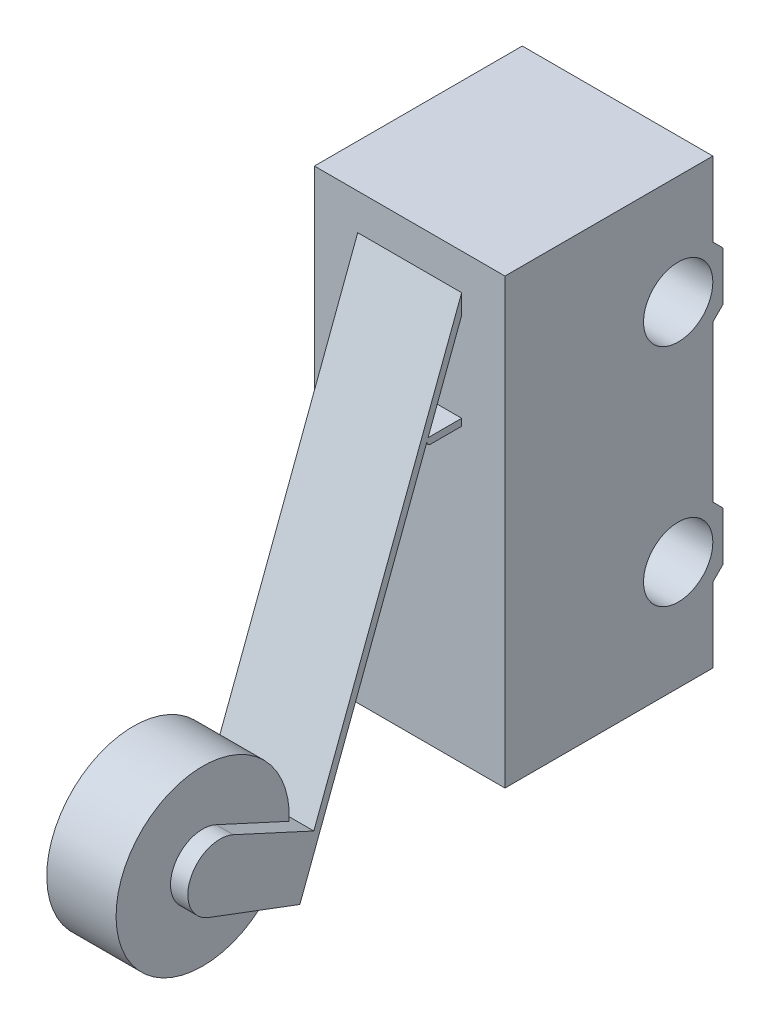
ISO-10303-21;
HEADER;
FILE_DESCRIPTION(('STEP AP214'),'2;1');
FILE_NAME('part.step','',(''),(''),'','','');
FILE_SCHEMA(('AUTOMOTIVE_DESIGN { 1 0 10303 214 1 1 1 1 }'));
ENDSEC;
DATA;
#1=APPLICATION_CONTEXT('core data for automotive mechanical design processes');
#2=APPLICATION_PROTOCOL_DEFINITION('international standard','automotive_design',2000,#1);
#3=PRODUCT_CONTEXT('',#1,'mechanical');
#4=PRODUCT('Part','Part','',(#3));
#5=PRODUCT_RELATED_PRODUCT_CATEGORY('part','',(#4));
#6=PRODUCT_DEFINITION_FORMATION('','',#4);
#7=PRODUCT_DEFINITION_CONTEXT('part definition',#1,'design');
#8=PRODUCT_DEFINITION('design','',#6,#7);
#9=PRODUCT_DEFINITION_SHAPE('','',#8);
#10=(LENGTH_UNIT() NAMED_UNIT(*) SI_UNIT(.MILLI.,.METRE.));
#11=(NAMED_UNIT(*) PLANE_ANGLE_UNIT() SI_UNIT($,.RADIAN.));
#12=(NAMED_UNIT(*) SI_UNIT($,.STERADIAN.) SOLID_ANGLE_UNIT());
#13=UNCERTAINTY_MEASURE_WITH_UNIT(LENGTH_MEASURE(1.E-05),#10,'distance_accuracy_value','');
#14=(GEOMETRIC_REPRESENTATION_CONTEXT(3) GLOBAL_UNCERTAINTY_ASSIGNED_CONTEXT((#13)) GLOBAL_UNIT_ASSIGNED_CONTEXT((#10,
#11,#12)) REPRESENTATION_CONTEXT('',''));
#15=CARTESIAN_POINT('',(0.,0.,0.));
#16=DIRECTION('',(0.,0.,1.));
#17=DIRECTION('',(1.,0.,0.));
#18=AXIS2_PLACEMENT_3D('',#15,#16,#17);
#19=CARTESIAN_POINT('',(-1.5,-12.1396148632047,6.97512508538025));
#20=DIRECTION('',(1.,0.,0.));
#21=DIRECTION('',(0.,0.,-1.));
#22=AXIS2_PLACEMENT_3D('',#19,#20,#21);
#23=CYLINDRICAL_SURFACE('',#22,0.927948868354279);
#24=DIRECTION('',(1.,0.,0.));
#25=VECTOR('',#24,1.);
#26=CARTESIAN_POINT('',(-1.5,-13.0079476813417,7.30236692137663));
#27=LINE('',#26,#25);
#28=CARTESIAN_POINT('',(-1.5,-13.0079476813417,7.30236692137663));
#29=VERTEX_POINT('',#28);
#30=CARTESIAN_POINT('',(-1.,-13.0079476813417,7.30236692137663));
#31=VERTEX_POINT('',#30);
#32=EDGE_CURVE('E332',#29,#31,#27,.T.);
#33=ORIENTED_EDGE('',*,*,#32,.T.);
#34=CARTESIAN_POINT('',(-1.,-12.1396148632047,6.97512508538025));
#35=DIRECTION('',(1.,0.,0.));
#36=DIRECTION('',(0.,0.,-1.));
#37=AXIS2_PLACEMENT_3D('',#34,#35,#36);
#38=CIRCLE('',#37,0.927948868354279);
#39=CARTESIAN_POINT('',(-1.,-11.2964810406253,6.58754998362256));
#40=VERTEX_POINT('',#39);
#41=EDGE_CURVE('E219',#31,#40,#38,.F.);
#42=ORIENTED_EDGE('',*,*,#41,.T.);
#43=DIRECTION('',(1.,0.,0.));
#44=VECTOR('',#43,1.);
#45=CARTESIAN_POINT('',(-1.5,-11.2964810406253,6.58754998362256));
#46=LINE('',#45,#44);
#47=CARTESIAN_POINT('',(-1.5,-11.2964810406253,6.58754998362256));
#48=VERTEX_POINT('',#47);
#49=EDGE_CURVE('E336',#48,#40,#46,.T.);
#50=ORIENTED_EDGE('',*,*,#49,.F.);
#51=CARTESIAN_POINT('',(-1.5,-12.1396148632047,6.97512508538025));
#52=DIRECTION('',(1.,0.,0.));
#53=DIRECTION('',(0.,0.,-1.));
#54=AXIS2_PLACEMENT_3D('',#51,#52,#53);
#55=CIRCLE('',#54,0.927948868354279);
#56=EDGE_CURVE('E308',#48,#29,#55,.T.);
#57=ORIENTED_EDGE('',*,*,#56,.T.);
#58=EDGE_LOOP('',(#33,#42,#50,#57));
#59=FACE_BOUND('',#58,.T.);
#60=ADVANCED_FACE('F39',(#59),#23,.T.);
#61=CARTESIAN_POINT('',(-2.75,0.,0.));
#62=DIRECTION('',(0.,0.,1.));
#63=DIRECTION('',(0.,-1.,0.));
#64=AXIS2_PLACEMENT_3D('',#61,#62,#63);
#65=PLANE('',#64);
#66=DIRECTION('',(1.,0.,0.));
#67=VECTOR('',#66,1.);
#68=CARTESIAN_POINT('',(-2.75,-12.8,0.));
#69=LINE('',#68,#67);
#70=CARTESIAN_POINT('',(-2.75,-12.8,0.));
#71=VERTEX_POINT('',#70);
#72=CARTESIAN_POINT('',(2.75,-12.8,0.));
#73=VERTEX_POINT('',#72);
#74=EDGE_CURVE('E466',#71,#73,#69,.T.);
#75=ORIENTED_EDGE('',*,*,#74,.T.);
#76=DIRECTION('',(0.,-1.,0.));
#77=VECTOR('',#76,1.);
#78=CARTESIAN_POINT('',(2.75,0.,0.));
#79=LINE('',#78,#77);
#80=CARTESIAN_POINT('',(2.75,0.,0.));
#81=VERTEX_POINT('',#80);
#82=EDGE_CURVE('E362',#81,#73,#79,.T.);
#83=ORIENTED_EDGE('',*,*,#82,.F.);
#84=DIRECTION('',(1.,0.,0.));
#85=VECTOR('',#84,1.);
#86=CARTESIAN_POINT('',(-2.75,0.,0.));
#87=LINE('',#86,#85);
#88=CARTESIAN_POINT('',(-2.75,0.,0.));
#89=VERTEX_POINT('',#88);
#90=EDGE_CURVE('E467',#89,#81,#87,.T.);
#91=ORIENTED_EDGE('',*,*,#90,.F.);
#92=DIRECTION('',(0.,-1.,0.));
#93=VECTOR('',#92,1.);
#94=CARTESIAN_POINT('',(-2.75,0.,0.));
#95=LINE('',#94,#93);
#96=EDGE_CURVE('E418',#89,#71,#95,.T.);
#97=ORIENTED_EDGE('',*,*,#96,.T.);
#98=EDGE_LOOP('',(#75,#83,#91,#97));
#99=FACE_BOUND('',#98,.T.);
#100=DIRECTION('',(1.,0.,0.));
#101=VECTOR('',#100,1.);
#102=CARTESIAN_POINT('',(-2.75,-1.60829263563845,0.));
#103=LINE('',#102,#101);
#104=CARTESIAN_POINT('',(-1.5,-1.60829263563845,0.));
#105=VERTEX_POINT('',#104);
#106=CARTESIAN_POINT('',(1.5,-1.60829263563845,0.));
#107=VERTEX_POINT('',#106);
#108=EDGE_CURVE('E506',#105,#107,#103,.T.);
#109=ORIENTED_EDGE('',*,*,#108,.F.);
#110=DIRECTION('',(0.,1.,0.));
#111=VECTOR('',#110,1.);
#112=CARTESIAN_POINT('',(-1.5,0.,0.));
#113=LINE('',#112,#111);
#114=CARTESIAN_POINT('',(-1.5,-1.04115923991667,0.));
#115=VERTEX_POINT('',#114);
#116=EDGE_CURVE('E510',#105,#115,#113,.T.);
#117=ORIENTED_EDGE('',*,*,#116,.T.);
#118=DIRECTION('',(1.,0.,0.));
#119=VECTOR('',#118,1.);
#120=CARTESIAN_POINT('',(-1.5,-1.04115923991667,0.));
#121=LINE('',#120,#119);
#122=CARTESIAN_POINT('',(1.5,-1.04115923991667,0.));
#123=VERTEX_POINT('',#122);
#124=EDGE_CURVE('E344',#115,#123,#121,.T.);
#125=ORIENTED_EDGE('',*,*,#124,.T.);
#126=DIRECTION('',(0.,1.,0.));
#127=VECTOR('',#126,1.);
#128=CARTESIAN_POINT('',(1.5,0.,0.));
#129=LINE('',#128,#127);
#130=EDGE_CURVE('E470',#107,#123,#129,.T.);
#131=ORIENTED_EDGE('',*,*,#130,.F.);
#132=EDGE_LOOP('',(#109,#117,#125,#131));
#133=FACE_BOUND('',#132,.T.);
#134=DIRECTION('',(1.,0.,0.));
#135=VECTOR('',#134,1.);
#136=CARTESIAN_POINT('',(-1.5,-4.38,0.));
#137=LINE('',#136,#135);
#138=CARTESIAN_POINT('',(-1.5,-4.38,0.));
#139=VERTEX_POINT('',#138);
#140=CARTESIAN_POINT('',(1.5,-4.38,0.));
#141=VERTEX_POINT('',#140);
#142=EDGE_CURVE('E63',#139,#141,#137,.T.);
#143=ORIENTED_EDGE('',*,*,#142,.F.);
#144=DIRECTION('',(0.,1.,0.));
#145=VECTOR('',#144,1.);
#146=CARTESIAN_POINT('',(-1.5,-4.38,0.));
#147=LINE('',#146,#145);
#148=CARTESIAN_POINT('',(-1.5,-4.18,0.));
#149=VERTEX_POINT('',#148);
#150=EDGE_CURVE('E290',#139,#149,#147,.T.);
#151=ORIENTED_EDGE('',*,*,#150,.T.);
#152=DIRECTION('',(1.,0.,0.));
#153=VECTOR('',#152,1.);
#154=CARTESIAN_POINT('',(-1.5,-4.18,0.));
#155=LINE('',#154,#153);
#156=CARTESIAN_POINT('',(1.5,-4.18,0.));
#157=VERTEX_POINT('',#156);
#158=EDGE_CURVE('E350',#149,#157,#155,.T.);
#159=ORIENTED_EDGE('',*,*,#158,.T.);
#160=DIRECTION('',(0.,1.,0.));
#161=VECTOR('',#160,1.);
#162=CARTESIAN_POINT('',(1.5,-4.38,0.));
#163=LINE('',#162,#161);
#164=EDGE_CURVE('E246',#141,#157,#163,.T.);
#165=ORIENTED_EDGE('',*,*,#164,.F.);
#166=EDGE_LOOP('',(#143,#151,#159,#165));
#167=FACE_BOUND('',#166,.T.);
#168=ADVANCED_FACE('F41',(#99,#133,#167),#65,.T.);
#169=CARTESIAN_POINT('',(-2.75,0.,0.));
#170=DIRECTION('',(0.,1.,0.));
#171=DIRECTION('',(0.,0.,1.));
#172=AXIS2_PLACEMENT_3D('',#169,#170,#171);
#173=PLANE('',#172);
#174=ORIENTED_EDGE('',*,*,#90,.T.);
#175=DIRECTION('',(0.,0.,1.));
#176=VECTOR('',#175,1.);
#177=CARTESIAN_POINT('',(2.75,0.,0.));
#178=LINE('',#177,#176);
#179=CARTESIAN_POINT('',(2.75,0.,-6.));
#180=VERTEX_POINT('',#179);
#181=EDGE_CURVE('E406',#180,#81,#178,.T.);
#182=ORIENTED_EDGE('',*,*,#181,.F.);
#183=DIRECTION('',(1.,0.,0.));
#184=VECTOR('',#183,1.);
#185=CARTESIAN_POINT('',(-2.75,0.,-6.));
#186=LINE('',#185,#184);
#187=CARTESIAN_POINT('',(-2.75,0.,-6.));
#188=VERTEX_POINT('',#187);
#189=EDGE_CURVE('E471',#188,#180,#186,.T.);
#190=ORIENTED_EDGE('',*,*,#189,.F.);
#191=DIRECTION('',(0.,0.,1.));
#192=VECTOR('',#191,1.);
#193=CARTESIAN_POINT('',(-2.75,0.,0.));
#194=LINE('',#193,#192);
#195=EDGE_CURVE('E462',#188,#89,#194,.T.);
#196=ORIENTED_EDGE('',*,*,#195,.T.);
#197=EDGE_LOOP('',(#174,#182,#190,#196));
#198=FACE_BOUND('',#197,.T.);
#199=ADVANCED_FACE('F575',(#198),#173,.T.);
#200=CARTESIAN_POINT('',(-2.75,0.,-6.));
#201=DIRECTION('',(0.,0.,-1.));
#202=DIRECTION('',(-1.,0.,0.));
#203=AXIS2_PLACEMENT_3D('',#200,#201,#202);
#204=PLANE('',#203);
#205=ORIENTED_EDGE('',*,*,#189,.T.);
#206=DIRECTION('',(0.,1.,0.));
#207=VECTOR('',#206,1.);
#208=CARTESIAN_POINT('',(2.75,0.,-6.));
#209=LINE('',#208,#207);
#210=CARTESIAN_POINT('',(2.75,-2.15,-6.));
#211=VERTEX_POINT('',#210);
#212=EDGE_CURVE('E402',#211,#180,#209,.T.);
#213=ORIENTED_EDGE('',*,*,#212,.F.);
#214=DIRECTION('',(1.,0.,0.));
#215=VECTOR('',#214,1.);
#216=CARTESIAN_POINT('',(-2.75,-2.15,-6.));
#217=LINE('',#216,#215);
#218=CARTESIAN_POINT('',(-2.75,-2.15,-6.));
#219=VERTEX_POINT('',#218);
#220=EDGE_CURVE('E474',#219,#211,#217,.T.);
#221=ORIENTED_EDGE('',*,*,#220,.F.);
#222=DIRECTION('',(0.,1.,0.));
#223=VECTOR('',#222,1.);
#224=CARTESIAN_POINT('',(-2.75,0.,-6.));
#225=LINE('',#224,#223);
#226=EDGE_CURVE('E458',#219,#188,#225,.T.);
#227=ORIENTED_EDGE('',*,*,#226,.T.);
#228=EDGE_LOOP('',(#205,#213,#221,#227));
#229=FACE_BOUND('',#228,.T.);
#230=ADVANCED_FACE('F581',(#229),#204,.T.);
#231=CARTESIAN_POINT('',(-2.75,-2.15,-6.));
#232=DIRECTION('',(0.,0.707106781186546,-0.707106781186549));
#233=DIRECTION('',(0.,0.707106781186549,0.707106781186546));
#234=AXIS2_PLACEMENT_3D('',#231,#232,#233);
#235=PLANE('',#234);
#236=ORIENTED_EDGE('',*,*,#220,.T.);
#237=DIRECTION('',(0.,0.707106781186549,0.707106781186547));
#238=VECTOR('',#237,1.);
#239=CARTESIAN_POINT('',(2.75,-2.15,-6.));
#240=LINE('',#239,#238);
#241=CARTESIAN_POINT('',(2.75,-2.45,-6.3));
#242=VERTEX_POINT('',#241);
#243=EDGE_CURVE('E398',#242,#211,#240,.T.);
#244=ORIENTED_EDGE('',*,*,#243,.F.);
#245=DIRECTION('',(1.,0.,0.));
#246=VECTOR('',#245,1.);
#247=CARTESIAN_POINT('',(-2.75,-2.45,-6.3));
#248=LINE('',#247,#246);
#249=CARTESIAN_POINT('',(-2.75,-2.45,-6.3));
#250=VERTEX_POINT('',#249);
#251=EDGE_CURVE('E477',#250,#242,#248,.T.);
#252=ORIENTED_EDGE('',*,*,#251,.F.);
#253=DIRECTION('',(0.,0.707106781186549,0.707106781186547));
#254=VECTOR('',#253,1.);
#255=CARTESIAN_POINT('',(-2.75,-2.15,-6.));
#256=LINE('',#255,#254);
#257=EDGE_CURVE('E454',#250,#219,#256,.T.);
#258=ORIENTED_EDGE('',*,*,#257,.T.);
#259=EDGE_LOOP('',(#236,#244,#252,#258));
#260=FACE_BOUND('',#259,.T.);
#261=ADVANCED_FACE('F631',(#260),#235,.T.);
#262=CARTESIAN_POINT('',(-2.75,-2.45,-6.3));
#263=DIRECTION('',(0.,0.,-1.));
#264=DIRECTION('',(-1.,0.,0.));
#265=AXIS2_PLACEMENT_3D('',#262,#263,#264);
#266=PLANE('',#265);
#267=ORIENTED_EDGE('',*,*,#251,.T.);
#268=DIRECTION('',(0.,1.,0.));
#269=VECTOR('',#268,1.);
#270=CARTESIAN_POINT('',(2.75,-2.45,-6.3));
#271=LINE('',#270,#269);
#272=CARTESIAN_POINT('',(2.75,-3.85,-6.3));
#273=VERTEX_POINT('',#272);
#274=EDGE_CURVE('E394',#273,#242,#271,.T.);
#275=ORIENTED_EDGE('',*,*,#274,.F.);
#276=DIRECTION('',(1.,0.,0.));
#277=VECTOR('',#276,1.);
#278=CARTESIAN_POINT('',(-2.75,-3.85,-6.3));
#279=LINE('',#278,#277);
#280=CARTESIAN_POINT('',(-2.75,-3.85,-6.3));
#281=VERTEX_POINT('',#280);
#282=EDGE_CURVE('E480',#281,#273,#279,.T.);
#283=ORIENTED_EDGE('',*,*,#282,.F.);
#284=DIRECTION('',(0.,1.,0.));
#285=VECTOR('',#284,1.);
#286=CARTESIAN_POINT('',(-2.75,-2.45,-6.3));
#287=LINE('',#286,#285);
#288=EDGE_CURVE('E450',#281,#250,#287,.T.);
#289=ORIENTED_EDGE('',*,*,#288,.T.);
#290=EDGE_LOOP('',(#267,#275,#283,#289));
#291=FACE_BOUND('',#290,.T.);
#292=ADVANCED_FACE('F627',(#291),#266,.T.);
#293=CARTESIAN_POINT('',(-2.75,-3.85,-6.3));
#294=DIRECTION('',(0.,-0.707106781186546,-0.707106781186549));
#295=DIRECTION('',(0.,0.707106781186549,-0.707106781186546));
#296=AXIS2_PLACEMENT_3D('',#293,#294,#295);
#297=PLANE('',#296);
#298=ORIENTED_EDGE('',*,*,#282,.T.);
#299=DIRECTION('',(0.,0.707106781186549,-0.707106781186547));
#300=VECTOR('',#299,1.);
#301=CARTESIAN_POINT('',(2.75,-3.85,-6.3));
#302=LINE('',#301,#300);
#303=CARTESIAN_POINT('',(2.75,-4.15,-6.));
#304=VERTEX_POINT('',#303);
#305=EDGE_CURVE('E390',#304,#273,#302,.T.);
#306=ORIENTED_EDGE('',*,*,#305,.F.);
#307=DIRECTION('',(1.,0.,0.));
#308=VECTOR('',#307,1.);
#309=CARTESIAN_POINT('',(-2.75,-4.15,-6.));
#310=LINE('',#309,#308);
#311=CARTESIAN_POINT('',(-2.75,-4.15,-6.));
#312=VERTEX_POINT('',#311);
#313=EDGE_CURVE('E483',#312,#304,#310,.T.);
#314=ORIENTED_EDGE('',*,*,#313,.F.);
#315=DIRECTION('',(0.,0.707106781186549,-0.707106781186547));
#316=VECTOR('',#315,1.);
#317=CARTESIAN_POINT('',(-2.75,-3.85,-6.3));
#318=LINE('',#317,#316);
#319=EDGE_CURVE('E446',#312,#281,#318,.T.);
#320=ORIENTED_EDGE('',*,*,#319,.T.);
#321=EDGE_LOOP('',(#298,#306,#314,#320));
#322=FACE_BOUND('',#321,.T.);
#323=ADVANCED_FACE('F623',(#322),#297,.T.);
#324=CARTESIAN_POINT('',(-2.75,-4.15,-6.));
#325=DIRECTION('',(0.,0.,-1.));
#326=DIRECTION('',(-1.,0.,0.));
#327=AXIS2_PLACEMENT_3D('',#324,#325,#326);
#328=PLANE('',#327);
#329=ORIENTED_EDGE('',*,*,#313,.T.);
#330=DIRECTION('',(0.,1.,0.));
#331=VECTOR('',#330,1.);
#332=CARTESIAN_POINT('',(2.75,-4.15,-6.));
#333=LINE('',#332,#331);
#334=CARTESIAN_POINT('',(2.75,-8.65,-6.));
#335=VERTEX_POINT('',#334);
#336=EDGE_CURVE('E386',#335,#304,#333,.T.);
#337=ORIENTED_EDGE('',*,*,#336,.F.);
#338=DIRECTION('',(1.,0.,0.));
#339=VECTOR('',#338,1.);
#340=CARTESIAN_POINT('',(-2.75,-8.65,-6.));
#341=LINE('',#340,#339);
#342=CARTESIAN_POINT('',(-2.75,-8.65,-6.));
#343=VERTEX_POINT('',#342);
#344=EDGE_CURVE('E486',#343,#335,#341,.T.);
#345=ORIENTED_EDGE('',*,*,#344,.F.);
#346=DIRECTION('',(0.,1.,0.));
#347=VECTOR('',#346,1.);
#348=CARTESIAN_POINT('',(-2.75,-4.15,-6.));
#349=LINE('',#348,#347);
#350=EDGE_CURVE('E442',#343,#312,#349,.T.);
#351=ORIENTED_EDGE('',*,*,#350,.T.);
#352=EDGE_LOOP('',(#329,#337,#345,#351));
#353=FACE_BOUND('',#352,.T.);
#354=ADVANCED_FACE('F621',(#353),#328,.T.);
#355=CARTESIAN_POINT('',(-2.75,-8.95,-6.3));
#356=DIRECTION('',(0.,0.707106781186549,-0.707106781186546));
#357=DIRECTION('',(0.,0.707106781186546,0.707106781186549));
#358=AXIS2_PLACEMENT_3D('',#355,#356,#357);
#359=PLANE('',#358);
#360=ORIENTED_EDGE('',*,*,#344,.T.);
#361=DIRECTION('',(0.,0.707106781186547,0.707106781186549));
#362=VECTOR('',#361,1.);
#363=CARTESIAN_POINT('',(2.75,-8.95,-6.3));
#364=LINE('',#363,#362);
#365=CARTESIAN_POINT('',(2.75,-8.95,-6.3));
#366=VERTEX_POINT('',#365);
#367=EDGE_CURVE('E382',#366,#335,#364,.T.);
#368=ORIENTED_EDGE('',*,*,#367,.F.);
#369=DIRECTION('',(1.,0.,0.));
#370=VECTOR('',#369,1.);
#371=CARTESIAN_POINT('',(-2.75,-8.95,-6.3));
#372=LINE('',#371,#370);
#373=CARTESIAN_POINT('',(-2.75,-8.95,-6.3));
#374=VERTEX_POINT('',#373);
#375=EDGE_CURVE('E489',#374,#366,#372,.T.);
#376=ORIENTED_EDGE('',*,*,#375,.F.);
#377=DIRECTION('',(0.,0.707106781186547,0.707106781186549));
#378=VECTOR('',#377,1.);
#379=CARTESIAN_POINT('',(-2.75,-8.95,-6.3));
#380=LINE('',#379,#378);
#381=EDGE_CURVE('E438',#374,#343,#380,.T.);
#382=ORIENTED_EDGE('',*,*,#381,.T.);
#383=EDGE_LOOP('',(#360,#368,#376,#382));
#384=FACE_BOUND('',#383,.T.);
#385=ADVANCED_FACE('F616',(#384),#359,.T.);
#386=CARTESIAN_POINT('',(-2.75,-10.35,-6.3));
#387=DIRECTION('',(0.,0.,-1.));
#388=DIRECTION('',(-1.,0.,0.));
#389=AXIS2_PLACEMENT_3D('',#386,#387,#388);
#390=PLANE('',#389);
#391=ORIENTED_EDGE('',*,*,#375,.T.);
#392=DIRECTION('',(0.,1.,0.));
#393=VECTOR('',#392,1.);
#394=CARTESIAN_POINT('',(2.75,-10.35,-6.3));
#395=LINE('',#394,#393);
#396=CARTESIAN_POINT('',(2.75,-10.35,-6.3));
#397=VERTEX_POINT('',#396);
#398=EDGE_CURVE('E378',#397,#366,#395,.T.);
#399=ORIENTED_EDGE('',*,*,#398,.F.);
#400=DIRECTION('',(1.,0.,0.));
#401=VECTOR('',#400,1.);
#402=CARTESIAN_POINT('',(-2.75,-10.35,-6.3));
#403=LINE('',#402,#401);
#404=CARTESIAN_POINT('',(-2.75,-10.35,-6.3));
#405=VERTEX_POINT('',#404);
#406=EDGE_CURVE('E492',#405,#397,#403,.T.);
#407=ORIENTED_EDGE('',*,*,#406,.F.);
#408=DIRECTION('',(0.,1.,0.));
#409=VECTOR('',#408,1.);
#410=CARTESIAN_POINT('',(-2.75,-10.35,-6.3));
#411=LINE('',#410,#409);
#412=EDGE_CURVE('E434',#405,#374,#411,.T.);
#413=ORIENTED_EDGE('',*,*,#412,.T.);
#414=EDGE_LOOP('',(#391,#399,#407,#413));
#415=FACE_BOUND('',#414,.T.);
#416=ADVANCED_FACE('F611',(#415),#390,.T.);
#417=CARTESIAN_POINT('',(-2.75,-10.65,-6.));
#418=DIRECTION('',(0.,-0.707106781186549,-0.707106781186546));
#419=DIRECTION('',(0.,0.707106781186546,-0.707106781186549));
#420=AXIS2_PLACEMENT_3D('',#417,#418,#419);
#421=PLANE('',#420);
#422=ORIENTED_EDGE('',*,*,#406,.T.);
#423=DIRECTION('',(0.,0.707106781186547,-0.707106781186549));
#424=VECTOR('',#423,1.);
#425=CARTESIAN_POINT('',(2.75,-10.65,-6.));
#426=LINE('',#425,#424);
#427=CARTESIAN_POINT('',(2.75,-10.65,-6.));
#428=VERTEX_POINT('',#427);
#429=EDGE_CURVE('E374',#428,#397,#426,.T.);
#430=ORIENTED_EDGE('',*,*,#429,.F.);
#431=DIRECTION('',(1.,0.,0.));
#432=VECTOR('',#431,1.);
#433=CARTESIAN_POINT('',(-2.75,-10.65,-6.));
#434=LINE('',#433,#432);
#435=CARTESIAN_POINT('',(-2.75,-10.65,-6.));
#436=VERTEX_POINT('',#435);
#437=EDGE_CURVE('E495',#436,#428,#434,.T.);
#438=ORIENTED_EDGE('',*,*,#437,.F.);
#439=DIRECTION('',(0.,0.707106781186547,-0.707106781186549));
#440=VECTOR('',#439,1.);
#441=CARTESIAN_POINT('',(-2.75,-10.65,-6.));
#442=LINE('',#441,#440);
#443=EDGE_CURVE('E430',#436,#405,#442,.T.);
#444=ORIENTED_EDGE('',*,*,#443,.T.);
#445=EDGE_LOOP('',(#422,#430,#438,#444));
#446=FACE_BOUND('',#445,.T.);
#447=ADVANCED_FACE('F609',(#446),#421,.T.);
#448=CARTESIAN_POINT('',(-2.75,-10.65,-6.));
#449=DIRECTION('',(0.,0.,-1.));
#450=DIRECTION('',(0.,1.,0.));
#451=AXIS2_PLACEMENT_3D('',#448,#449,#450);
#452=PLANE('',#451);
#453=ORIENTED_EDGE('',*,*,#437,.T.);
#454=DIRECTION('',(0.,1.,0.));
#455=VECTOR('',#454,1.);
#456=CARTESIAN_POINT('',(2.75,-10.65,-6.));
#457=LINE('',#456,#455);
#458=CARTESIAN_POINT('',(2.75,-12.8,-6.));
#459=VERTEX_POINT('',#458);
#460=EDGE_CURVE('E370',#459,#428,#457,.T.);
#461=ORIENTED_EDGE('',*,*,#460,.F.);
#462=DIRECTION('',(1.,0.,0.));
#463=VECTOR('',#462,1.);
#464=CARTESIAN_POINT('',(-2.75,-12.8,-6.));
#465=LINE('',#464,#463);
#466=CARTESIAN_POINT('',(-2.75,-12.8,-6.));
#467=VERTEX_POINT('',#466);
#468=EDGE_CURVE('E498',#467,#459,#465,.T.);
#469=ORIENTED_EDGE('',*,*,#468,.F.);
#470=DIRECTION('',(0.,1.,0.));
#471=VECTOR('',#470,1.);
#472=CARTESIAN_POINT('',(-2.75,-10.65,-6.));
#473=LINE('',#472,#471);
#474=EDGE_CURVE('E426',#467,#436,#473,.T.);
#475=ORIENTED_EDGE('',*,*,#474,.T.);
#476=EDGE_LOOP('',(#453,#461,#469,#475));
#477=FACE_BOUND('',#476,.T.);
#478=ADVANCED_FACE('F605',(#477),#452,.T.);
#479=CARTESIAN_POINT('',(-2.75,-12.8,0.));
#480=DIRECTION('',(0.,-1.,0.));
#481=DIRECTION('',(0.,0.,-1.));
#482=AXIS2_PLACEMENT_3D('',#479,#480,#481);
#483=PLANE('',#482);
#484=ORIENTED_EDGE('',*,*,#468,.T.);
#485=DIRECTION('',(0.,0.,-1.));
#486=VECTOR('',#485,1.);
#487=CARTESIAN_POINT('',(2.75,-12.8,0.));
#488=LINE('',#487,#486);
#489=EDGE_CURVE('E366',#73,#459,#488,.T.);
#490=ORIENTED_EDGE('',*,*,#489,.F.);
#491=ORIENTED_EDGE('',*,*,#74,.F.);
#492=DIRECTION('',(0.,0.,-1.));
#493=VECTOR('',#492,1.);
#494=CARTESIAN_POINT('',(-2.75,-12.8,0.));
#495=LINE('',#494,#493);
#496=EDGE_CURVE('E422',#71,#467,#495,.T.);
#497=ORIENTED_EDGE('',*,*,#496,.T.);
#498=EDGE_LOOP('',(#484,#490,#491,#497));
#499=FACE_BOUND('',#498,.T.);
#500=ADVANCED_FACE('F590',(#499),#483,.T.);
#501=CARTESIAN_POINT('',(-2.75,0.,0.));
#502=DIRECTION('',(1.,0.,0.));
#503=DIRECTION('',(0.,0.,-1.));
#504=AXIS2_PLACEMENT_3D('',#501,#502,#503);
#505=PLANE('',#504);
#506=CARTESIAN_POINT('',(-2.75,-9.65,-5.));
#507=DIRECTION('',(1.,0.,0.));
#508=DIRECTION('',(0.,0.,-1.));
#509=AXIS2_PLACEMENT_3D('',#506,#507,#508);
#510=CIRCLE('',#509,1.);
#511=CARTESIAN_POINT('',(-2.75,-9.65,-6.));
#512=VERTEX_POINT('',#511);
#513=EDGE_CURVE('E410',#512,#512,#510,.T.);
#514=ORIENTED_EDGE('',*,*,#513,.T.);
#515=EDGE_LOOP('',(#514));
#516=FACE_BOUND('',#515,.T.);
#517=CARTESIAN_POINT('',(-2.75,-3.15,-5.));
#518=DIRECTION('',(1.,0.,0.));
#519=DIRECTION('',(0.,0.,-1.));
#520=AXIS2_PLACEMENT_3D('',#517,#518,#519);
#521=CIRCLE('',#520,1.);
#522=CARTESIAN_POINT('',(-2.75,-3.15,-6.));
#523=VERTEX_POINT('',#522);
#524=EDGE_CURVE('E414',#523,#523,#521,.T.);
#525=ORIENTED_EDGE('',*,*,#524,.T.);
#526=EDGE_LOOP('',(#525));
#527=FACE_BOUND('',#526,.T.);
#528=ORIENTED_EDGE('',*,*,#96,.F.);
#529=ORIENTED_EDGE('',*,*,#195,.F.);
#530=ORIENTED_EDGE('',*,*,#226,.F.);
#531=ORIENTED_EDGE('',*,*,#257,.F.);
#532=ORIENTED_EDGE('',*,*,#288,.F.);
#533=ORIENTED_EDGE('',*,*,#319,.F.);
#534=ORIENTED_EDGE('',*,*,#350,.F.);
#535=ORIENTED_EDGE('',*,*,#381,.F.);
#536=ORIENTED_EDGE('',*,*,#412,.F.);
#537=ORIENTED_EDGE('',*,*,#443,.F.);
#538=ORIENTED_EDGE('',*,*,#474,.F.);
#539=ORIENTED_EDGE('',*,*,#496,.F.);
#540=EDGE_LOOP('',(#528,#529,#530,#531,#532,#533,#534,#535,#536,#537,#538,#539));
#541=FACE_BOUND('',#540,.T.);
#542=ADVANCED_FACE('F599',(#516,#527,#541),#505,.F.);
#543=CARTESIAN_POINT('',(-2.75,-3.15,-5.));
#544=DIRECTION('',(1.,0.,0.));
#545=DIRECTION('',(0.,0.,-1.));
#546=AXIS2_PLACEMENT_3D('',#543,#544,#545);
#547=CYLINDRICAL_SURFACE('',#546,1.);
#548=ORIENTED_EDGE('',*,*,#524,.F.);
#549=EDGE_LOOP('',(#548));
#550=FACE_BOUND('',#549,.T.);
#551=CARTESIAN_POINT('',(2.75,-3.15,-5.));
#552=DIRECTION('',(1.,0.,0.));
#553=DIRECTION('',(0.,0.,-1.));
#554=AXIS2_PLACEMENT_3D('',#551,#552,#553);
#555=CIRCLE('',#554,1.);
#556=CARTESIAN_POINT('',(2.75,-3.15,-6.));
#557=VERTEX_POINT('',#556);
#558=EDGE_CURVE('E358',#557,#557,#555,.T.);
#559=ORIENTED_EDGE('',*,*,#558,.T.);
#560=EDGE_LOOP('',(#559));
#561=FACE_BOUND('',#560,.T.);
#562=ADVANCED_FACE('F658',(#550,#561),#547,.F.);
#563=CARTESIAN_POINT('',(-2.75,-9.65,-5.));
#564=DIRECTION('',(1.,0.,0.));
#565=DIRECTION('',(0.,0.,-1.));
#566=AXIS2_PLACEMENT_3D('',#563,#564,#565);
#567=CYLINDRICAL_SURFACE('',#566,1.);
#568=ORIENTED_EDGE('',*,*,#513,.F.);
#569=EDGE_LOOP('',(#568));
#570=FACE_BOUND('',#569,.T.);
#571=CARTESIAN_POINT('',(2.75,-9.65,-5.));
#572=DIRECTION('',(1.,0.,0.));
#573=DIRECTION('',(0.,0.,-1.));
#574=AXIS2_PLACEMENT_3D('',#571,#572,#573);
#575=CIRCLE('',#574,1.);
#576=CARTESIAN_POINT('',(2.75,-9.65,-6.));
#577=VERTEX_POINT('',#576);
#578=EDGE_CURVE('E325',#577,#577,#575,.T.);
#579=ORIENTED_EDGE('',*,*,#578,.T.);
#580=EDGE_LOOP('',(#579));
#581=FACE_BOUND('',#580,.T.);
#582=ADVANCED_FACE('F663',(#570,#581),#567,.F.);
#583=CARTESIAN_POINT('',(2.75,0.,0.));
#584=DIRECTION('',(1.,0.,0.));
#585=DIRECTION('',(0.,0.,-1.));
#586=AXIS2_PLACEMENT_3D('',#583,#584,#585);
#587=PLANE('',#586);
#588=ORIENTED_EDGE('',*,*,#558,.F.);
#589=EDGE_LOOP('',(#588));
#590=FACE_BOUND('',#589,.T.);
#591=ORIENTED_EDGE('',*,*,#82,.T.);
#592=ORIENTED_EDGE('',*,*,#489,.T.);
#593=ORIENTED_EDGE('',*,*,#460,.T.);
#594=ORIENTED_EDGE('',*,*,#429,.T.);
#595=ORIENTED_EDGE('',*,*,#398,.T.);
#596=ORIENTED_EDGE('',*,*,#367,.T.);
#597=ORIENTED_EDGE('',*,*,#336,.T.);
#598=ORIENTED_EDGE('',*,*,#305,.T.);
#599=ORIENTED_EDGE('',*,*,#274,.T.);
#600=ORIENTED_EDGE('',*,*,#243,.T.);
#601=ORIENTED_EDGE('',*,*,#212,.T.);
#602=ORIENTED_EDGE('',*,*,#181,.T.);
#603=EDGE_LOOP('',(#591,#592,#593,#594,#595,#596,#597,#598,#599,#600,#601,#602));
#604=FACE_BOUND('',#603,.T.);
#605=ORIENTED_EDGE('',*,*,#578,.F.);
#606=EDGE_LOOP('',(#605));
#607=FACE_BOUND('',#606,.T.);
#608=ADVANCED_FACE('F593',(#590,#604,#607),#587,.T.);
#609=CARTESIAN_POINT('',(-1.5,-4.38,0.900000000000001));
#610=DIRECTION('',(0.,-1.,0.));
#611=DIRECTION('',(0.,0.,-1.));
#612=AXIS2_PLACEMENT_3D('',#609,#610,#611);
#613=PLANE('',#612);
#614=ORIENTED_EDGE('',*,*,#142,.T.);
#615=DIRECTION('',(0.,0.,-1.));
#616=VECTOR('',#615,1.);
#617=CARTESIAN_POINT('',(1.5,-4.38,0.900000000000001));
#618=LINE('',#617,#616);
#619=CARTESIAN_POINT('',(1.5,-4.38,0.900000000000001));
#620=VERTEX_POINT('',#619);
#621=EDGE_CURVE('E241',#620,#141,#618,.T.);
#622=ORIENTED_EDGE('',*,*,#621,.F.);
#623=DIRECTION('',(1.,0.,0.));
#624=VECTOR('',#623,1.);
#625=CARTESIAN_POINT('',(-1.5,-4.38,0.900000000000001));
#626=LINE('',#625,#624);
#627=CARTESIAN_POINT('',(-1.5,-4.38,0.900000000000001));
#628=VERTEX_POINT('',#627);
#629=EDGE_CURVE('E322',#628,#620,#626,.T.);
#630=ORIENTED_EDGE('',*,*,#629,.F.);
#631=DIRECTION('',(0.,0.,-1.));
#632=VECTOR('',#631,1.);
#633=CARTESIAN_POINT('',(-1.5,-4.38,0.900000000000001));
#634=LINE('',#633,#632);
#635=EDGE_CURVE('E286',#628,#139,#634,.T.);
#636=ORIENTED_EDGE('',*,*,#635,.T.);
#637=EDGE_LOOP('',(#614,#622,#630,#636));
#638=FACE_BOUND('',#637,.T.);
#639=ADVANCED_FACE('F562',(#638),#613,.T.);
#640=CARTESIAN_POINT('',(-1.5,-4.28,0.900000000000001));
#641=DIRECTION('',(1.,0.,0.));
#642=DIRECTION('',(0.,0.,-1.));
#643=AXIS2_PLACEMENT_3D('',#640,#641,#642);
#644=CYLINDRICAL_SURFACE('',#643,0.1);
#645=ORIENTED_EDGE('',*,*,#629,.T.);
#646=CARTESIAN_POINT('',(1.5,-4.28,0.900000000000001));
#647=DIRECTION('',(1.,0.,0.));
#648=DIRECTION('',(0.,0.,-1.));
#649=AXIS2_PLACEMENT_3D('',#646,#647,#648);
#650=CIRCLE('',#649,0.1);
#651=CARTESIAN_POINT('',(1.5,-4.24473492805948,0.993575502675809));
#652=VERTEX_POINT('',#651);
#653=EDGE_CURVE('E282',#652,#620,#650,.T.);
#654=ORIENTED_EDGE('',*,*,#653,.F.);
#655=DIRECTION('',(1.,0.,0.));
#656=VECTOR('',#655,1.);
#657=CARTESIAN_POINT('',(-1.5,-4.24473492805948,0.993575502675809));
#658=LINE('',#657,#656);
#659=CARTESIAN_POINT('',(-1.5,-4.24473492805948,0.993575502675809));
#660=VERTEX_POINT('',#659);
#661=EDGE_CURVE('E326',#660,#652,#658,.T.);
#662=ORIENTED_EDGE('',*,*,#661,.F.);
#663=CARTESIAN_POINT('',(-1.5,-4.28,0.900000000000001));
#664=DIRECTION('',(1.,0.,0.));
#665=DIRECTION('',(0.,0.,-1.));
#666=AXIS2_PLACEMENT_3D('',#663,#664,#665);
#667=CIRCLE('',#666,0.1);
#668=EDGE_CURVE('E318',#660,#628,#667,.T.);
#669=ORIENTED_EDGE('',*,*,#668,.T.);
#670=EDGE_LOOP('',(#645,#654,#662,#669));
#671=FACE_BOUND('',#670,.T.);
#672=ADVANCED_FACE('F559',(#671),#644,.T.);
#673=CARTESIAN_POINT('',(-1.5,-4.24473492805948,0.993575502675809));
#674=DIRECTION('',(0.,-0.352650719405198,-0.93575502675807));
#675=DIRECTION('',(0.,0.93575502675807,-0.352650719405198));
#676=AXIS2_PLACEMENT_3D('',#673,#674,#675);
#677=PLANE('',#676);
#678=ORIENTED_EDGE('',*,*,#661,.T.);
#679=DIRECTION('',(0.,0.93575502675807,-0.352650719405198));
#680=VECTOR('',#679,1.);
#681=CARTESIAN_POINT('',(1.5,-4.37401477415369,1.04229619284155));
#682=LINE('',#681,#680);
#683=CARTESIAN_POINT('',(1.5,-14.,4.66996638194987));
#684=VERTEX_POINT('',#683);
#685=EDGE_CURVE('E278',#684,#652,#682,.T.);
#686=ORIENTED_EDGE('',*,*,#685,.F.);
#687=DIRECTION('',(1.,0.,0.));
#688=VECTOR('',#687,1.);
#689=CARTESIAN_POINT('',(-1.5,-14.,4.66996638194987));
#690=LINE('',#689,#688);
#691=CARTESIAN_POINT('',(-1.5,-14.,4.66996638194987));
#692=VERTEX_POINT('',#691);
#693=EDGE_CURVE('E329',#692,#684,#690,.T.);
#694=ORIENTED_EDGE('',*,*,#693,.F.);
#695=DIRECTION('',(0.,0.93575502675807,-0.352650719405198));
#696=VECTOR('',#695,1.);
#697=CARTESIAN_POINT('',(-1.5,-4.37401477415369,1.04229619284155));
#698=LINE('',#697,#696);
#699=EDGE_CURVE('E315',#692,#660,#698,.T.);
#700=ORIENTED_EDGE('',*,*,#699,.T.);
#701=EDGE_LOOP('',(#678,#686,#694,#700));
#702=FACE_BOUND('',#701,.T.);
#703=ADVANCED_FACE('F554',(#702),#677,.T.);
#704=CARTESIAN_POINT('',(-1.5,-14.,4.66996638194987));
#705=DIRECTION('',(0.,-0.935755026758063,0.352650719405216));
#706=DIRECTION('',(0.,-0.352650719405216,-0.935755026758063));
#707=AXIS2_PLACEMENT_3D('',#704,#705,#706);
#708=PLANE('',#707);
#709=DIRECTION('',(0.,0.352650719405216,0.935755026758063));
#710=VECTOR('',#709,1.);
#711=CARTESIAN_POINT('',(1.,-14.,4.66996638194987));
#712=LINE('',#711,#710);
#713=CARTESIAN_POINT('',(1.,-13.826592044072,5.13010259466819));
#714=VERTEX_POINT('',#713);
#715=CARTESIAN_POINT('',(1.,-13.0079476813417,7.30236692137663));
#716=VERTEX_POINT('',#715);
#717=EDGE_CURVE('E239',#714,#716,#712,.T.);
#718=ORIENTED_EDGE('',*,*,#717,.F.);
#719=DIRECTION('',(-1.,0.,0.));
#720=VECTOR('',#719,1.);
#721=CARTESIAN_POINT('',(1.,-13.826592044072,5.13010259466819));
#722=LINE('',#721,#720);
#723=CARTESIAN_POINT('',(-1.,-13.826592044072,5.13010259466819));
#724=VERTEX_POINT('',#723);
#725=EDGE_CURVE('E229',#714,#724,#722,.T.);
#726=ORIENTED_EDGE('',*,*,#725,.T.);
#727=DIRECTION('',(0.,0.352650719405216,0.935755026758063));
#728=VECTOR('',#727,1.);
#729=CARTESIAN_POINT('',(-1.,-14.,4.66996638194987));
#730=LINE('',#729,#728);
#731=EDGE_CURVE('E216',#724,#31,#730,.T.);
#732=ORIENTED_EDGE('',*,*,#731,.T.);
#733=ORIENTED_EDGE('',*,*,#32,.F.);
#734=DIRECTION('',(0.,-0.352650719405197,-0.93575502675807));
#735=VECTOR('',#734,1.);
#736=CARTESIAN_POINT('',(-1.5,-13.929469856119,4.85711738730148));
#737=LINE('',#736,#735);
#738=EDGE_CURVE('E312',#29,#692,#737,.T.);
#739=ORIENTED_EDGE('',*,*,#738,.T.);
#740=ORIENTED_EDGE('',*,*,#693,.T.);
#741=DIRECTION('',(0.,-0.352650719405197,-0.93575502675807));
#742=VECTOR('',#741,1.);
#743=CARTESIAN_POINT('',(1.5,-13.929469856119,4.85711738730148));
#744=LINE('',#743,#742);
#745=CARTESIAN_POINT('',(1.5,-13.0079476813417,7.30236692137663));
#746=VERTEX_POINT('',#745);
#747=EDGE_CURVE('E274',#746,#684,#744,.T.);
#748=ORIENTED_EDGE('',*,*,#747,.F.);
#749=EDGE_CURVE('E335',#716,#746,#27,.T.);
#750=ORIENTED_EDGE('',*,*,#749,.F.);
#751=EDGE_LOOP('',(#718,#726,#732,#733,#739,#740,#748,#750));
#752=FACE_BOUND('',#751,.T.);
#753=ADVANCED_FACE('F237',(#752),#708,.T.);
#754=CARTESIAN_POINT('',(1.,-12.1396148632047,6.97512508538025));
#755=DIRECTION('',(1.,0.,0.));
#756=DIRECTION('',(0.,0.,-1.));
#757=AXIS2_PLACEMENT_3D('',#754,#755,#756);
#758=CIRCLE('',#757,0.927948868354279);
#759=CARTESIAN_POINT('',(1.,-11.2964810406253,6.58754998362256));
#760=VERTEX_POINT('',#759);
#761=EDGE_CURVE('E224',#716,#760,#758,.F.);
#762=ORIENTED_EDGE('',*,*,#761,.F.);
#763=ORIENTED_EDGE('',*,*,#749,.T.);
#764=CARTESIAN_POINT('',(1.5,-12.1396148632047,6.97512508538025));
#765=DIRECTION('',(1.,0.,0.));
#766=DIRECTION('',(0.,0.,-1.));
#767=AXIS2_PLACEMENT_3D('',#764,#765,#766);
#768=CIRCLE('',#767,0.927948868354279);
#769=CARTESIAN_POINT('',(1.5,-11.2964810406253,6.58754998362256));
#770=VERTEX_POINT('',#769);
#771=EDGE_CURVE('E270',#770,#746,#768,.T.);
#772=ORIENTED_EDGE('',*,*,#771,.F.);
#773=EDGE_CURVE('E340',#760,#770,#46,.T.);
#774=ORIENTED_EDGE('',*,*,#773,.F.);
#775=EDGE_LOOP('',(#762,#763,#772,#774));
#776=FACE_BOUND('',#775,.T.);
#777=ADVANCED_FACE('F531',(#776),#23,.T.);
#778=CARTESIAN_POINT('',(-1.5,-11.2964810406253,6.58754998362256));
#779=DIRECTION('',(0.,0.908599440478642,-0.417668596810795));
#780=DIRECTION('',(0.,0.417668596810795,0.908599440478642));
#781=AXIS2_PLACEMENT_3D('',#778,#779,#780);
#782=PLANE('',#781);
#783=DIRECTION('',(0.,-0.417668596810795,-0.908599440478642));
#784=VECTOR('',#783,1.);
#785=CARTESIAN_POINT('',(1.,-11.2964810406253,6.58754998362256));
#786=LINE('',#785,#784);
#787=CARTESIAN_POINT('',(1.,-12.2660580851449,4.47832471057545));
#788=VERTEX_POINT('',#787);
#789=EDGE_CURVE('E11',#760,#788,#786,.T.);
#790=ORIENTED_EDGE('',*,*,#789,.F.);
#791=ORIENTED_EDGE('',*,*,#773,.T.);
#792=DIRECTION('',(0.,0.417668596810795,0.908599440478642));
#793=VECTOR('',#792,1.);
#794=CARTESIAN_POINT('',(1.5,-11.2964810406253,6.58754998362256));
#795=LINE('',#794,#793);
#796=CARTESIAN_POINT('',(1.5,-12.3632595559214,4.26687189215515));
#797=VERTEX_POINT('',#796);
#798=EDGE_CURVE('E266',#797,#770,#795,.T.);
#799=ORIENTED_EDGE('',*,*,#798,.F.);
#800=DIRECTION('',(1.,0.,0.));
#801=VECTOR('',#800,1.);
#802=CARTESIAN_POINT('',(-1.5,-12.3632595559214,4.26687189215515));
#803=LINE('',#802,#801);
#804=CARTESIAN_POINT('',(-1.5,-12.3632595559214,4.26687189215515));
#805=VERTEX_POINT('',#804);
#806=EDGE_CURVE('E341',#805,#797,#803,.T.);
#807=ORIENTED_EDGE('',*,*,#806,.F.);
#808=DIRECTION('',(0.,0.417668596810795,0.908599440478642));
#809=VECTOR('',#808,1.);
#810=CARTESIAN_POINT('',(-1.5,-11.2964810406253,6.58754998362256));
#811=LINE('',#810,#809);
#812=EDGE_CURVE('E304',#805,#48,#811,.T.);
#813=ORIENTED_EDGE('',*,*,#812,.T.);
#814=ORIENTED_EDGE('',*,*,#49,.T.);
#815=DIRECTION('',(0.,-0.417668596810795,-0.908599440478642));
#816=VECTOR('',#815,1.);
#817=CARTESIAN_POINT('',(-1.,-11.2964810406253,6.58754998362256));
#818=LINE('',#817,#816);
#819=CARTESIAN_POINT('',(-1.,-12.2660580851449,4.47832471057545));
#820=VERTEX_POINT('',#819);
#821=EDGE_CURVE('E513',#40,#820,#818,.T.);
#822=ORIENTED_EDGE('',*,*,#821,.T.);
#823=DIRECTION('',(-1.,0.,0.));
#824=VECTOR('',#823,1.);
#825=CARTESIAN_POINT('',(1.,-12.2660580851449,4.47832471057545));
#826=LINE('',#825,#824);
#827=EDGE_CURVE('E48',#820,#788,#826,.F.);
#828=ORIENTED_EDGE('',*,*,#827,.T.);
#829=EDGE_LOOP('',(#790,#791,#799,#807,#813,#814,#822,#828));
#830=FACE_BOUND('',#829,.T.);
#831=ADVANCED_FACE('F518',(#830),#782,.T.);
#832=CARTESIAN_POINT('',(-1.5,-12.3632595559214,4.26687189215515));
#833=DIRECTION('',(0.,0.352650719405198,0.93575502675807));
#834=DIRECTION('',(0.,-0.93575502675807,0.352650719405198));
#835=AXIS2_PLACEMENT_3D('',#832,#833,#834);
#836=PLANE('',#835);
#837=ORIENTED_EDGE('',*,*,#806,.T.);
#838=DIRECTION('',(0.,-0.93575502675807,0.352650719405198));
#839=VECTOR('',#838,1.);
#840=CARTESIAN_POINT('',(1.5,-12.3632595559214,4.26687189215515));
#841=LINE('',#840,#839);
#842=EDGE_CURVE('E262',#123,#797,#841,.T.);
#843=ORIENTED_EDGE('',*,*,#842,.F.);
#844=ORIENTED_EDGE('',*,*,#124,.F.);
#845=DIRECTION('',(0.,-0.93575502675807,0.352650719405198));
#846=VECTOR('',#845,1.);
#847=CARTESIAN_POINT('',(-1.5,-12.3632595559214,4.26687189215515));
#848=LINE('',#847,#846);
#849=EDGE_CURVE('E300',#115,#805,#848,.T.);
#850=ORIENTED_EDGE('',*,*,#849,.T.);
#851=EDGE_LOOP('',(#837,#843,#844,#850));
#852=FACE_BOUND('',#851,.T.);
#853=ADVANCED_FACE('F542',(#852),#836,.T.);
#854=CARTESIAN_POINT('',(-1.5,-1.11168938379771,-0.187151005351613));
#855=DIRECTION('',(0.,-0.352650719405198,-0.93575502675807));
#856=DIRECTION('',(0.,0.93575502675807,-0.352650719405198));
#857=AXIS2_PLACEMENT_3D('',#854,#855,#856);
#858=PLANE('',#857);
#859=DIRECTION('',(0.,0.93575502675807,-0.352650719405198));
#860=VECTOR('',#859,1.);
#861=CARTESIAN_POINT('',(-1.5,-1.11168938379771,-0.187151005351613));
#862=LINE('',#861,#860);
#863=CARTESIAN_POINT('',(-1.5,-4.18,0.969179353792795));
#864=VERTEX_POINT('',#863);
#865=EDGE_CURVE('E296',#864,#105,#862,.T.);
#866=ORIENTED_EDGE('',*,*,#865,.T.);
#867=ORIENTED_EDGE('',*,*,#108,.T.);
#868=DIRECTION('',(0.,0.93575502675807,-0.352650719405198));
#869=VECTOR('',#868,1.);
#870=CARTESIAN_POINT('',(1.5,-1.11168938379771,-0.187151005351613));
#871=LINE('',#870,#869);
#872=CARTESIAN_POINT('',(1.5,-4.18,0.969179353792795));
#873=VERTEX_POINT('',#872);
#874=EDGE_CURVE('E258',#873,#107,#871,.T.);
#875=ORIENTED_EDGE('',*,*,#874,.F.);
#876=DIRECTION('',(1.,0.,0.));
#877=VECTOR('',#876,1.);
#878=CARTESIAN_POINT('',(-1.5,-4.18,0.969179353792795));
#879=LINE('',#878,#877);
#880=EDGE_CURVE('E347',#864,#873,#879,.T.);
#881=ORIENTED_EDGE('',*,*,#880,.F.);
#882=EDGE_LOOP('',(#866,#867,#875,#881));
#883=FACE_BOUND('',#882,.T.);
#884=ADVANCED_FACE('F572',(#883),#858,.T.);
#885=CARTESIAN_POINT('',(-1.5,-4.18,0.900000000000001));
#886=DIRECTION('',(0.,1.,0.));
#887=DIRECTION('',(0.,0.,1.));
#888=AXIS2_PLACEMENT_3D('',#885,#886,#887);
#889=PLANE('',#888);
#890=ORIENTED_EDGE('',*,*,#880,.T.);
#891=DIRECTION('',(0.,0.,1.));
#892=VECTOR('',#891,1.);
#893=CARTESIAN_POINT('',(1.5,-4.18,0.));
#894=LINE('',#893,#892);
#895=EDGE_CURVE('E254',#157,#873,#894,.T.);
#896=ORIENTED_EDGE('',*,*,#895,.F.);
#897=ORIENTED_EDGE('',*,*,#158,.F.);
#898=DIRECTION('',(0.,0.,1.));
#899=VECTOR('',#898,1.);
#900=CARTESIAN_POINT('',(-1.5,-4.18,0.));
#901=LINE('',#900,#899);
#902=EDGE_CURVE('E293',#149,#864,#901,.T.);
#903=ORIENTED_EDGE('',*,*,#902,.T.);
#904=EDGE_LOOP('',(#890,#896,#897,#903));
#905=FACE_BOUND('',#904,.T.);
#906=ADVANCED_FACE('F568',(#905),#889,.T.);
#907=CARTESIAN_POINT('',(-1.5,-12.1396148632047,6.97512508538025));
#908=DIRECTION('',(1.,0.,0.));
#909=DIRECTION('',(0.,0.,-1.));
#910=AXIS2_PLACEMENT_3D('',#907,#908,#909);
#911=PLANE('',#910);
#912=ORIENTED_EDGE('',*,*,#116,.F.);
#913=ORIENTED_EDGE('',*,*,#865,.F.);
#914=ORIENTED_EDGE('',*,*,#902,.F.);
#915=ORIENTED_EDGE('',*,*,#150,.F.);
#916=ORIENTED_EDGE('',*,*,#635,.F.);
#917=ORIENTED_EDGE('',*,*,#668,.F.);
#918=ORIENTED_EDGE('',*,*,#699,.F.);
#919=ORIENTED_EDGE('',*,*,#738,.F.);
#920=ORIENTED_EDGE('',*,*,#56,.F.);
#921=ORIENTED_EDGE('',*,*,#812,.F.);
#922=ORIENTED_EDGE('',*,*,#849,.F.);
#923=EDGE_LOOP('',(#912,#913,#914,#915,#916,#917,#918,#919,#920,#921,#922));
#924=FACE_BOUND('',#923,.T.);
#925=ADVANCED_FACE('F547',(#924),#911,.F.);
#926=CARTESIAN_POINT('',(1.5,-12.1396148632047,6.97512508538025));
#927=DIRECTION('',(1.,0.,0.));
#928=DIRECTION('',(0.,0.,-1.));
#929=AXIS2_PLACEMENT_3D('',#926,#927,#928);
#930=PLANE('',#929);
#931=ORIENTED_EDGE('',*,*,#874,.T.);
#932=ORIENTED_EDGE('',*,*,#130,.T.);
#933=ORIENTED_EDGE('',*,*,#842,.T.);
#934=ORIENTED_EDGE('',*,*,#798,.T.);
#935=ORIENTED_EDGE('',*,*,#771,.T.);
#936=ORIENTED_EDGE('',*,*,#747,.T.);
#937=ORIENTED_EDGE('',*,*,#685,.T.);
#938=ORIENTED_EDGE('',*,*,#653,.T.);
#939=ORIENTED_EDGE('',*,*,#621,.T.);
#940=ORIENTED_EDGE('',*,*,#164,.T.);
#941=ORIENTED_EDGE('',*,*,#895,.T.);
#942=EDGE_LOOP('',(#931,#932,#933,#934,#935,#936,#937,#938,#939,#940,#941));
#943=FACE_BOUND('',#942,.T.);
#944=ADVANCED_FACE('F538',(#943),#930,.T.);
#945=CARTESIAN_POINT('',(1.,-12.1396148632047,6.97512508538025));
#946=DIRECTION('',(-1.,0.,0.));
#947=DIRECTION('',(0.,0.,1.));
#948=AXIS2_PLACEMENT_3D('',#945,#946,#947);
#949=CYLINDRICAL_SURFACE('',#948,2.5);
#950=ORIENTED_EDGE('',*,*,#725,.F.);
#951=CARTESIAN_POINT('',(1.,-12.1396148632047,6.97512508538025));
#952=DIRECTION('',(1.,0.,0.));
#953=DIRECTION('',(0.,0.,-1.));
#954=AXIS2_PLACEMENT_3D('',#951,#952,#953);
#955=CIRCLE('',#954,2.5);
#956=EDGE_CURVE('E234',#788,#714,#955,.T.);
#957=ORIENTED_EDGE('',*,*,#956,.F.);
#958=ORIENTED_EDGE('',*,*,#827,.F.);
#959=CARTESIAN_POINT('',(-1.,-12.1396148632047,6.97512508538025));
#960=DIRECTION('',(1.,0.,0.));
#961=DIRECTION('',(0.,0.,-1.));
#962=AXIS2_PLACEMENT_3D('',#959,#960,#961);
#963=CIRCLE('',#962,2.5);
#964=EDGE_CURVE('E55',#820,#724,#963,.T.);
#965=ORIENTED_EDGE('',*,*,#964,.T.);
#966=EDGE_LOOP('',(#950,#957,#958,#965));
#967=FACE_BOUND('',#966,.T.);
#968=ADVANCED_FACE('F227',(#967),#949,.T.);
#969=CARTESIAN_POINT('',(1.,-12.1396148632047,6.97512508538025));
#970=DIRECTION('',(1.,0.,0.));
#971=DIRECTION('',(0.,0.,-1.));
#972=AXIS2_PLACEMENT_3D('',#969,#970,#971);
#973=PLANE('',#972);
#974=ORIENTED_EDGE('',*,*,#956,.T.);
#975=ORIENTED_EDGE('',*,*,#717,.T.);
#976=ORIENTED_EDGE('',*,*,#761,.T.);
#977=ORIENTED_EDGE('',*,*,#789,.T.);
#978=EDGE_LOOP('',(#974,#975,#976,#977));
#979=FACE_BOUND('',#978,.T.);
#980=ADVANCED_FACE('F529',(#979),#973,.T.);
#981=CARTESIAN_POINT('',(-1.,-12.1396148632047,6.97512508538025));
#982=DIRECTION('',(1.,0.,0.));
#983=DIRECTION('',(0.,0.,-1.));
#984=AXIS2_PLACEMENT_3D('',#981,#982,#983);
#985=PLANE('',#984);
#986=ORIENTED_EDGE('',*,*,#731,.F.);
#987=ORIENTED_EDGE('',*,*,#964,.F.);
#988=ORIENTED_EDGE('',*,*,#821,.F.);
#989=ORIENTED_EDGE('',*,*,#41,.F.);
#990=EDGE_LOOP('',(#986,#987,#988,#989));
#991=FACE_BOUND('',#990,.T.);
#992=ADVANCED_FACE('F217',(#991),#985,.F.);
#993=CLOSED_SHELL('',(#60,#168,#199,#230,#261,#292,#323,#354,#385,#416,#447,#478,#500,#542,#562,
#582,#608,#639,#672,#703,#753,#777,#831,#853,#884,#906,#925,#944,#968,#980,#992));
#994=MANIFOLD_SOLID_BREP('B2',#993);
#995=ADVANCED_BREP_SHAPE_REPRESENTATION('',(#18,#994),#14);
#996=SHAPE_DEFINITION_REPRESENTATION(#9,#995);
ENDSEC;
END-ISO-10303-21;
